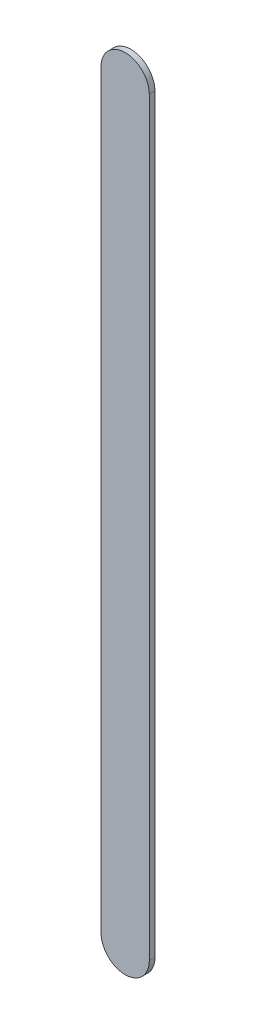
ISO-10303-21;
HEADER;
FILE_DESCRIPTION(('STEP AP214'),'2;1');
FILE_NAME('part.step','',(''),(''),'','','');
FILE_SCHEMA(('AUTOMOTIVE_DESIGN { 1 0 10303 214 1 1 1 1 }'));
ENDSEC;
DATA;
#1=APPLICATION_CONTEXT('core data for automotive mechanical design processes');
#2=APPLICATION_PROTOCOL_DEFINITION('international standard','automotive_design',2000,#1);
#3=PRODUCT_CONTEXT('',#1,'mechanical');
#4=PRODUCT('Part','Part','',(#3));
#5=PRODUCT_RELATED_PRODUCT_CATEGORY('part','',(#4));
#6=PRODUCT_DEFINITION_FORMATION('','',#4);
#7=PRODUCT_DEFINITION_CONTEXT('part definition',#1,'design');
#8=PRODUCT_DEFINITION('design','',#6,#7);
#9=PRODUCT_DEFINITION_SHAPE('','',#8);
#10=(LENGTH_UNIT() NAMED_UNIT(*) SI_UNIT(.MILLI.,.METRE.));
#11=(NAMED_UNIT(*) PLANE_ANGLE_UNIT() SI_UNIT($,.RADIAN.));
#12=(NAMED_UNIT(*) SI_UNIT($,.STERADIAN.) SOLID_ANGLE_UNIT());
#13=UNCERTAINTY_MEASURE_WITH_UNIT(LENGTH_MEASURE(1.E-05),#10,'distance_accuracy_value','');
#14=(GEOMETRIC_REPRESENTATION_CONTEXT(3) GLOBAL_UNCERTAINTY_ASSIGNED_CONTEXT((#13)) GLOBAL_UNIT_ASSIGNED_CONTEXT((#10,
#11,#12)) REPRESENTATION_CONTEXT('',''));
#15=CARTESIAN_POINT('',(0.,0.,0.));
#16=DIRECTION('',(0.,0.,1.));
#17=DIRECTION('',(1.,0.,0.));
#18=AXIS2_PLACEMENT_3D('',#15,#16,#17);
#19=CARTESIAN_POINT('',(124.35,-69.9125,1.635));
#20=DIRECTION('',(0.,0.,1.));
#21=DIRECTION('',(1.,0.,0.));
#22=AXIS2_PLACEMENT_3D('',#19,#20,#21);
#23=PLANE('',#22);
#24=DIRECTION('',(0.,-1.,0.));
#25=VECTOR('',#24,1.);
#26=CARTESIAN_POINT('',(124.35,-69.9125,1.635));
#27=LINE('',#26,#25);
#28=CARTESIAN_POINT('',(124.35,-69.9125,1.635));
#29=VERTEX_POINT('',#28);
#30=CARTESIAN_POINT('',(124.35,-74.58,1.635));
#31=VERTEX_POINT('',#30);
#32=EDGE_CURVE('E93',#29,#31,#27,.T.);
#33=ORIENTED_EDGE('',*,*,#32,.T.);
#34=CARTESIAN_POINT('',(124.5,-74.58,1.635));
#35=DIRECTION('',(0.,0.,1.));
#36=DIRECTION('',(-1.,0.,0.));
#37=AXIS2_PLACEMENT_3D('',#34,#35,#36);
#38=CIRCLE('',#37,0.15);
#39=CARTESIAN_POINT('',(124.65,-74.58,1.635));
#40=VERTEX_POINT('',#39);
#41=EDGE_CURVE('E72',#31,#40,#38,.T.);
#42=ORIENTED_EDGE('',*,*,#41,.T.);
#43=DIRECTION('',(0.,1.,0.));
#44=VECTOR('',#43,1.);
#45=CARTESIAN_POINT('',(124.65,-74.58,1.635));
#46=LINE('',#45,#44);
#47=CARTESIAN_POINT('',(124.65,-69.9125,1.635));
#48=VERTEX_POINT('',#47);
#49=EDGE_CURVE('E87',#40,#48,#46,.T.);
#50=ORIENTED_EDGE('',*,*,#49,.T.);
#51=CARTESIAN_POINT('',(124.5,-69.9125,1.635));
#52=DIRECTION('',(0.,0.,1.));
#53=DIRECTION('',(1.,0.,0.));
#54=AXIS2_PLACEMENT_3D('',#51,#52,#53);
#55=CIRCLE('',#54,0.15);
#56=EDGE_CURVE('E11',#48,#29,#55,.T.);
#57=ORIENTED_EDGE('',*,*,#56,.T.);
#58=EDGE_LOOP('',(#33,#42,#50,#57));
#59=FACE_BOUND('',#58,.T.);
#60=ADVANCED_FACE('F17',(#59),#23,.T.);
#61=CARTESIAN_POINT('',(124.35,-69.9125,1.6));
#62=DIRECTION('',(0.,0.,1.));
#63=DIRECTION('',(1.,0.,0.));
#64=AXIS2_PLACEMENT_3D('',#61,#62,#63);
#65=PLANE('',#64);
#66=CARTESIAN_POINT('',(124.5,-69.9125,1.6));
#67=DIRECTION('',(0.,0.,1.));
#68=DIRECTION('',(1.,0.,0.));
#69=AXIS2_PLACEMENT_3D('',#66,#67,#68);
#70=CIRCLE('',#69,0.15);
#71=CARTESIAN_POINT('',(124.65,-69.9125,1.6));
#72=VERTEX_POINT('',#71);
#73=CARTESIAN_POINT('',(124.35,-69.9125,1.6));
#74=VERTEX_POINT('',#73);
#75=EDGE_CURVE('E20',#72,#74,#70,.T.);
#76=ORIENTED_EDGE('',*,*,#75,.F.);
#77=DIRECTION('',(0.,1.,0.));
#78=VECTOR('',#77,1.);
#79=CARTESIAN_POINT('',(124.65,-74.58,1.6));
#80=LINE('',#79,#78);
#81=CARTESIAN_POINT('',(124.65,-74.58,1.6));
#82=VERTEX_POINT('',#81);
#83=EDGE_CURVE('E58',#82,#72,#80,.T.);
#84=ORIENTED_EDGE('',*,*,#83,.F.);
#85=CARTESIAN_POINT('',(124.5,-74.58,1.6));
#86=DIRECTION('',(0.,0.,1.));
#87=DIRECTION('',(-1.,0.,0.));
#88=AXIS2_PLACEMENT_3D('',#85,#86,#87);
#89=CIRCLE('',#88,0.15);
#90=CARTESIAN_POINT('',(124.35,-74.58,1.6));
#91=VERTEX_POINT('',#90);
#92=EDGE_CURVE('E95',#91,#82,#89,.T.);
#93=ORIENTED_EDGE('',*,*,#92,.F.);
#94=DIRECTION('',(0.,-1.,0.));
#95=VECTOR('',#94,1.);
#96=CARTESIAN_POINT('',(124.35,-69.9125,1.6));
#97=LINE('',#96,#95);
#98=EDGE_CURVE('E92',#74,#91,#97,.T.);
#99=ORIENTED_EDGE('',*,*,#98,.F.);
#100=EDGE_LOOP('',(#76,#84,#93,#99));
#101=FACE_BOUND('',#100,.T.);
#102=ADVANCED_FACE('F97',(#101),#65,.F.);
#103=CARTESIAN_POINT('',(124.5,-69.9125,1.6));
#104=DIRECTION('',(0.,0.,-1.));
#105=DIRECTION('',(1.,0.,0.));
#106=AXIS2_PLACEMENT_3D('',#103,#104,#105);
#107=CYLINDRICAL_SURFACE('',#106,0.15);
#108=ORIENTED_EDGE('',*,*,#75,.T.);
#109=DIRECTION('',(0.,0.,1.));
#110=VECTOR('',#109,1.);
#111=CARTESIAN_POINT('',(124.35,-69.9125,1.6));
#112=LINE('',#111,#110);
#113=EDGE_CURVE('E82',#74,#29,#112,.T.);
#114=ORIENTED_EDGE('',*,*,#113,.T.);
#115=ORIENTED_EDGE('',*,*,#56,.F.);
#116=DIRECTION('',(0.,0.,1.));
#117=VECTOR('',#116,1.);
#118=CARTESIAN_POINT('',(124.65,-69.9125,1.6));
#119=LINE('',#118,#117);
#120=EDGE_CURVE('E85',#72,#48,#119,.T.);
#121=ORIENTED_EDGE('',*,*,#120,.F.);
#122=EDGE_LOOP('',(#108,#114,#115,#121));
#123=FACE_BOUND('',#122,.T.);
#124=ADVANCED_FACE('F81',(#123),#107,.T.);
#125=CARTESIAN_POINT('',(124.65,-74.58,1.6));
#126=DIRECTION('',(-1.,0.,0.));
#127=DIRECTION('',(0.,0.,1.));
#128=AXIS2_PLACEMENT_3D('',#125,#126,#127);
#129=PLANE('',#128);
#130=ORIENTED_EDGE('',*,*,#83,.T.);
#131=ORIENTED_EDGE('',*,*,#120,.T.);
#132=ORIENTED_EDGE('',*,*,#49,.F.);
#133=DIRECTION('',(0.,0.,1.));
#134=VECTOR('',#133,1.);
#135=CARTESIAN_POINT('',(124.65,-74.58,1.6));
#136=LINE('',#135,#134);
#137=EDGE_CURVE('E112',#82,#40,#136,.T.);
#138=ORIENTED_EDGE('',*,*,#137,.F.);
#139=EDGE_LOOP('',(#130,#131,#132,#138));
#140=FACE_BOUND('',#139,.T.);
#141=ADVANCED_FACE('F124',(#140),#129,.F.);
#142=CARTESIAN_POINT('',(124.5,-74.58,1.6));
#143=DIRECTION('',(0.,0.,-1.));
#144=DIRECTION('',(-1.,0.,0.));
#145=AXIS2_PLACEMENT_3D('',#142,#143,#144);
#146=CYLINDRICAL_SURFACE('',#145,0.15);
#147=ORIENTED_EDGE('',*,*,#92,.T.);
#148=ORIENTED_EDGE('',*,*,#137,.T.);
#149=ORIENTED_EDGE('',*,*,#41,.F.);
#150=DIRECTION('',(0.,0.,1.));
#151=VECTOR('',#150,1.);
#152=CARTESIAN_POINT('',(124.35,-74.58,1.6));
#153=LINE('',#152,#151);
#154=EDGE_CURVE('E100',#91,#31,#153,.T.);
#155=ORIENTED_EDGE('',*,*,#154,.F.);
#156=EDGE_LOOP('',(#147,#148,#149,#155));
#157=FACE_BOUND('',#156,.T.);
#158=ADVANCED_FACE('F125',(#157),#146,.T.);
#159=CARTESIAN_POINT('',(124.35,-69.9125,1.6));
#160=DIRECTION('',(1.,0.,0.));
#161=DIRECTION('',(0.,1.,0.));
#162=AXIS2_PLACEMENT_3D('',#159,#160,#161);
#163=PLANE('',#162);
#164=ORIENTED_EDGE('',*,*,#98,.T.);
#165=ORIENTED_EDGE('',*,*,#154,.T.);
#166=ORIENTED_EDGE('',*,*,#32,.F.);
#167=ORIENTED_EDGE('',*,*,#113,.F.);
#168=EDGE_LOOP('',(#164,#165,#166,#167));
#169=FACE_BOUND('',#168,.T.);
#170=ADVANCED_FACE('F90',(#169),#163,.F.);
#171=CLOSED_SHELL('',(#60,#102,#124,#141,#158,#170));
#172=MANIFOLD_SOLID_BREP('B1',#171);
#173=ADVANCED_BREP_SHAPE_REPRESENTATION('',(#18,#172),#14);
#174=SHAPE_DEFINITION_REPRESENTATION(#9,#173);
ENDSEC;
END-ISO-10303-21;
